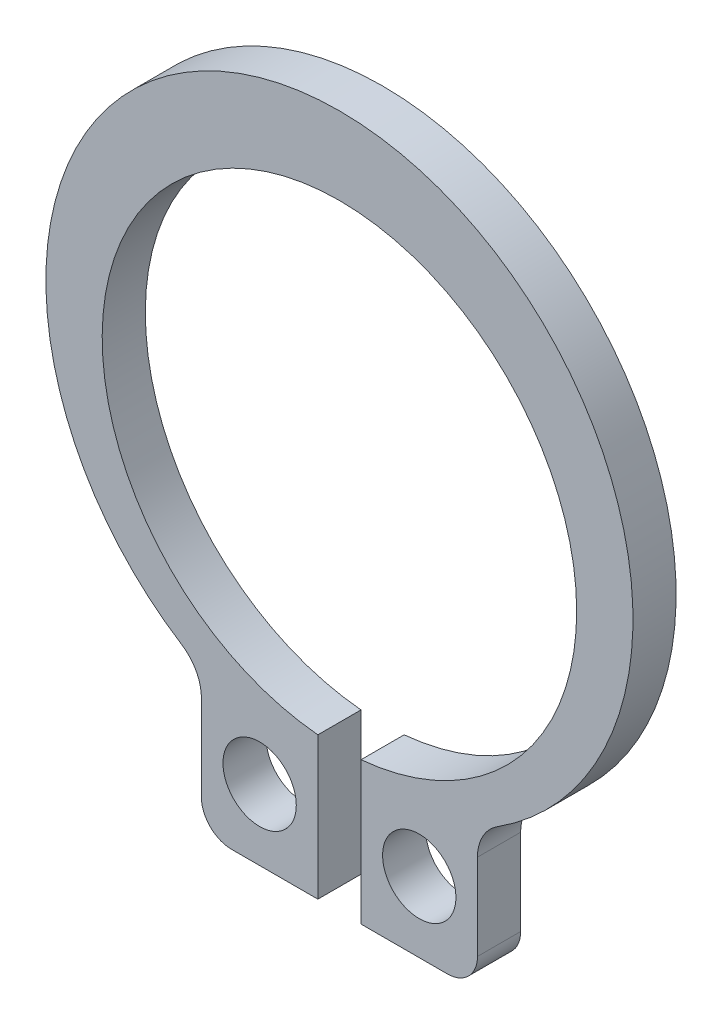
ISO-10303-21;
HEADER;
FILE_DESCRIPTION(('STEP AP214'),'2;1');
FILE_NAME('part.step','',(''),(''),'','','');
FILE_SCHEMA(('AUTOMOTIVE_DESIGN { 1 0 10303 214 1 1 1 1 }'));
ENDSEC;
DATA;
#1=APPLICATION_CONTEXT('core data for automotive mechanical design processes');
#2=APPLICATION_PROTOCOL_DEFINITION('international standard','automotive_design',2000,#1);
#3=PRODUCT_CONTEXT('',#1,'mechanical');
#4=PRODUCT('Part','Part','',(#3));
#5=PRODUCT_RELATED_PRODUCT_CATEGORY('part','',(#4));
#6=PRODUCT_DEFINITION_FORMATION('','',#4);
#7=PRODUCT_DEFINITION_CONTEXT('part definition',#1,'design');
#8=PRODUCT_DEFINITION('design','',#6,#7);
#9=PRODUCT_DEFINITION_SHAPE('','',#8);
#10=(LENGTH_UNIT() NAMED_UNIT(*) SI_UNIT(.MILLI.,.METRE.));
#11=(NAMED_UNIT(*) PLANE_ANGLE_UNIT() SI_UNIT($,.RADIAN.));
#12=(NAMED_UNIT(*) SI_UNIT($,.STERADIAN.) SOLID_ANGLE_UNIT());
#13=UNCERTAINTY_MEASURE_WITH_UNIT(LENGTH_MEASURE(1.E-05),#10,'distance_accuracy_value','');
#14=(GEOMETRIC_REPRESENTATION_CONTEXT(3) GLOBAL_UNCERTAINTY_ASSIGNED_CONTEXT((#13)) GLOBAL_UNIT_ASSIGNED_CONTEXT((#10,
#11,#12)) REPRESENTATION_CONTEXT('',''));
#15=CARTESIAN_POINT('',(0.,0.,0.));
#16=DIRECTION('',(0.,0.,1.));
#17=DIRECTION('',(1.,0.,0.));
#18=AXIS2_PLACEMENT_3D('',#15,#16,#17);
#19=CARTESIAN_POINT('',(0.,0.,1.));
#20=DIRECTION('',(0.,0.,1.));
#21=DIRECTION('',(1.,0.,0.));
#22=AXIS2_PLACEMENT_3D('',#19,#20,#21);
#23=PLANE('',#22);
#24=CARTESIAN_POINT('',(-1.85,-7.14394582484242,1.));
#25=DIRECTION('',(0.,0.,1.));
#26=DIRECTION('',(1.,0.,0.));
#27=AXIS2_PLACEMENT_3D('',#24,#25,#26);
#28=CIRCLE('',#27,0.85);
#29=CARTESIAN_POINT('',(-0.999999999999999,-7.14394582484242,1.));
#30=VERTEX_POINT('',#29);
#31=EDGE_CURVE('E215',#30,#30,#28,.T.);
#32=ORIENTED_EDGE('',*,*,#31,.F.);
#33=EDGE_LOOP('',(#32));
#34=FACE_BOUND('',#33,.T.);
#35=DIRECTION('',(1.,0.,0.));
#36=VECTOR('',#35,1.);
#37=CARTESIAN_POINT('',(0.500000000000001,-8.77722557505166,1.));
#38=LINE('',#37,#36);
#39=CARTESIAN_POINT('',(0.500000000000001,-8.77722557505166,1.));
#40=VERTEX_POINT('',#39);
#41=CARTESIAN_POINT('',(2.5,-8.77722557505166,1.));
#42=VERTEX_POINT('',#41);
#43=EDGE_CURVE('E131',#40,#42,#38,.T.);
#44=ORIENTED_EDGE('',*,*,#43,.T.);
#45=CARTESIAN_POINT('',(2.5,-8.07722557505166,1.));
#46=DIRECTION('',(0.,0.,1.));
#47=DIRECTION('',(1.,0.,0.));
#48=AXIS2_PLACEMENT_3D('',#45,#46,#47);
#49=CIRCLE('',#48,0.7);
#50=CARTESIAN_POINT('',(3.2,-8.07722557505166,1.));
#51=VERTEX_POINT('',#50);
#52=EDGE_CURVE('E181',#42,#51,#49,.T.);
#53=ORIENTED_EDGE('',*,*,#52,.T.);
#54=DIRECTION('',(0.,1.,0.));
#55=VECTOR('',#54,1.);
#56=CARTESIAN_POINT('',(3.2,-8.77722557505166,1.));
#57=LINE('',#56,#55);
#58=CARTESIAN_POINT('',(3.2,-6.0836035752278,1.));
#59=VERTEX_POINT('',#58);
#60=EDGE_CURVE('E235',#51,#59,#57,.T.);
#61=ORIENTED_EDGE('',*,*,#60,.T.);
#62=CARTESIAN_POINT('',(4.2,-6.0836035752278,1.));
#63=DIRECTION('',(0.,0.,1.));
#64=DIRECTION('',(1.,0.,0.));
#65=AXIS2_PLACEMENT_3D('',#62,#63,#64);
#66=CIRCLE('',#65,1.);
#67=CARTESIAN_POINT('',(3.66188340807175,-5.24073316200194,1.));
#68=VERTEX_POINT('',#67);
#69=EDGE_CURVE('E165',#59,#68,#66,.F.);
#70=ORIENTED_EDGE('',*,*,#69,.T.);
#71=CARTESIAN_POINT('',(0.,0.495000000000001,1.));
#72=DIRECTION('',(0.,0.,1.));
#73=DIRECTION('',(1.,0.,0.));
#74=AXIS2_PLACEMENT_3D('',#71,#72,#73);
#75=CIRCLE('',#74,6.805);
#76=CARTESIAN_POINT('',(-3.66188340807175,-5.24073316200195,1.));
#77=VERTEX_POINT('',#76);
#78=EDGE_CURVE('E233',#68,#77,#75,.T.);
#79=ORIENTED_EDGE('',*,*,#78,.T.);
#80=CARTESIAN_POINT('',(-4.2,-6.0836035752278,1.));
#81=DIRECTION('',(0.,0.,1.));
#82=DIRECTION('',(1.,0.,0.));
#83=AXIS2_PLACEMENT_3D('',#80,#81,#82);
#84=CIRCLE('',#83,1.);
#85=CARTESIAN_POINT('',(-3.2,-6.0836035752278,1.));
#86=VERTEX_POINT('',#85);
#87=EDGE_CURVE('E169',#77,#86,#84,.F.);
#88=ORIENTED_EDGE('',*,*,#87,.T.);
#89=DIRECTION('',(0.,-1.,0.));
#90=VECTOR('',#89,1.);
#91=CARTESIAN_POINT('',(-3.2,-8.77722557505166,1.));
#92=LINE('',#91,#90);
#93=CARTESIAN_POINT('',(-3.2,-8.07722557505166,1.));
#94=VERTEX_POINT('',#93);
#95=EDGE_CURVE('E209',#86,#94,#92,.T.);
#96=ORIENTED_EDGE('',*,*,#95,.T.);
#97=CARTESIAN_POINT('',(-2.5,-8.07722557505166,1.));
#98=DIRECTION('',(0.,0.,1.));
#99=DIRECTION('',(1.,0.,0.));
#100=AXIS2_PLACEMENT_3D('',#97,#98,#99);
#101=CIRCLE('',#100,0.7);
#102=CARTESIAN_POINT('',(-2.5,-8.77722557505166,1.));
#103=VERTEX_POINT('',#102);
#104=EDGE_CURVE('E47',#94,#103,#101,.T.);
#105=ORIENTED_EDGE('',*,*,#104,.T.);
#106=DIRECTION('',(1.,0.,0.));
#107=VECTOR('',#106,1.);
#108=CARTESIAN_POINT('',(-0.499999999999999,-8.77722557505166,1.));
#109=LINE('',#108,#107);
#110=CARTESIAN_POINT('',(-0.499999999999999,-8.77722557505166,1.));
#111=VERTEX_POINT('',#110);
#112=EDGE_CURVE('E190',#103,#111,#109,.T.);
#113=ORIENTED_EDGE('',*,*,#112,.T.);
#114=DIRECTION('',(0.,1.,0.));
#115=VECTOR('',#114,1.);
#116=CARTESIAN_POINT('',(-0.499999999999999,-5.47722557505166,1.));
#117=LINE('',#116,#115);
#118=CARTESIAN_POINT('',(-0.499999999999999,-5.47722557505166,1.));
#119=VERTEX_POINT('',#118);
#120=EDGE_CURVE('E137',#111,#119,#117,.T.);
#121=ORIENTED_EDGE('',*,*,#120,.T.);
#122=CARTESIAN_POINT('',(0.,0.,1.));
#123=DIRECTION('',(0.,0.,-1.));
#124=DIRECTION('',(1.,0.,0.));
#125=AXIS2_PLACEMENT_3D('',#122,#123,#124);
#126=CIRCLE('',#125,5.5);
#127=CARTESIAN_POINT('',(0.500000000000001,-5.47722557505166,1.));
#128=VERTEX_POINT('',#127);
#129=EDGE_CURVE('E132',#119,#128,#126,.T.);
#130=ORIENTED_EDGE('',*,*,#129,.T.);
#131=DIRECTION('',(0.,-1.,0.));
#132=VECTOR('',#131,1.);
#133=CARTESIAN_POINT('',(0.500000000000001,-5.47722557505166,1.));
#134=LINE('',#133,#132);
#135=EDGE_CURVE('E121',#128,#40,#134,.T.);
#136=ORIENTED_EDGE('',*,*,#135,.T.);
#137=EDGE_LOOP('',(#44,#53,#61,#70,#79,#88,#96,#105,#113,#121,#130,#136));
#138=FACE_BOUND('',#137,.T.);
#139=CARTESIAN_POINT('',(1.85,-7.14394582484242,1.));
#140=DIRECTION('',(0.,0.,1.));
#141=DIRECTION('',(-1.,0.,0.));
#142=AXIS2_PLACEMENT_3D('',#139,#140,#141);
#143=CIRCLE('',#142,0.85);
#144=CARTESIAN_POINT('',(1.,-7.14394582484242,1.));
#145=VERTEX_POINT('',#144);
#146=EDGE_CURVE('E243',#145,#145,#143,.T.);
#147=ORIENTED_EDGE('',*,*,#146,.F.);
#148=EDGE_LOOP('',(#147));
#149=FACE_BOUND('',#148,.T.);
#150=ADVANCED_FACE('F32',(#34,#138,#149),#23,.T.);
#151=CARTESIAN_POINT('',(0.,0.,0.));
#152=DIRECTION('',(0.,0.,1.));
#153=DIRECTION('',(1.,0.,0.));
#154=AXIS2_PLACEMENT_3D('',#151,#152,#153);
#155=PLANE('',#154);
#156=CARTESIAN_POINT('',(-1.85,-7.14394582484242,0.));
#157=DIRECTION('',(0.,0.,1.));
#158=DIRECTION('',(1.,0.,0.));
#159=AXIS2_PLACEMENT_3D('',#156,#157,#158);
#160=CIRCLE('',#159,0.85);
#161=CARTESIAN_POINT('',(-0.999999999999999,-7.14394582484242,0.));
#162=VERTEX_POINT('',#161);
#163=EDGE_CURVE('E240',#162,#162,#160,.T.);
#164=ORIENTED_EDGE('',*,*,#163,.T.);
#165=EDGE_LOOP('',(#164));
#166=FACE_BOUND('',#165,.T.);
#167=DIRECTION('',(0.,1.,0.));
#168=VECTOR('',#167,1.);
#169=CARTESIAN_POINT('',(3.2,-8.77722557505166,0.));
#170=LINE('',#169,#168);
#171=CARTESIAN_POINT('',(3.2,-8.07722557505166,0.));
#172=VERTEX_POINT('',#171);
#173=CARTESIAN_POINT('',(3.2,-6.0836035752278,0.));
#174=VERTEX_POINT('',#173);
#175=EDGE_CURVE('E220',#172,#174,#170,.T.);
#176=ORIENTED_EDGE('',*,*,#175,.F.);
#177=CARTESIAN_POINT('',(2.5,-8.07722557505166,0.));
#178=DIRECTION('',(0.,0.,1.));
#179=DIRECTION('',(1.,0.,0.));
#180=AXIS2_PLACEMENT_3D('',#177,#178,#179);
#181=CIRCLE('',#180,0.7);
#182=CARTESIAN_POINT('',(2.5,-8.77722557505166,0.));
#183=VERTEX_POINT('',#182);
#184=EDGE_CURVE('E176',#172,#183,#181,.F.);
#185=ORIENTED_EDGE('',*,*,#184,.T.);
#186=DIRECTION('',(1.,0.,0.));
#187=VECTOR('',#186,1.);
#188=CARTESIAN_POINT('',(0.500000000000001,-8.77722557505166,0.));
#189=LINE('',#188,#187);
#190=CARTESIAN_POINT('',(0.500000000000001,-8.77722557505166,0.));
#191=VERTEX_POINT('',#190);
#192=EDGE_CURVE('E217',#191,#183,#189,.T.);
#193=ORIENTED_EDGE('',*,*,#192,.F.);
#194=DIRECTION('',(0.,-1.,0.));
#195=VECTOR('',#194,1.);
#196=CARTESIAN_POINT('',(0.500000000000001,-5.47722557505166,0.));
#197=LINE('',#196,#195);
#198=CARTESIAN_POINT('',(0.500000000000001,-5.47722557505166,0.));
#199=VERTEX_POINT('',#198);
#200=EDGE_CURVE('E214',#199,#191,#197,.T.);
#201=ORIENTED_EDGE('',*,*,#200,.F.);
#202=CARTESIAN_POINT('',(0.,0.,0.));
#203=DIRECTION('',(0.,0.,-1.));
#204=DIRECTION('',(1.,0.,0.));
#205=AXIS2_PLACEMENT_3D('',#202,#203,#204);
#206=CIRCLE('',#205,5.5);
#207=CARTESIAN_POINT('',(-0.499999999999999,-5.47722557505166,0.));
#208=VERTEX_POINT('',#207);
#209=EDGE_CURVE('E145',#208,#199,#206,.T.);
#210=ORIENTED_EDGE('',*,*,#209,.F.);
#211=DIRECTION('',(0.,1.,0.));
#212=VECTOR('',#211,1.);
#213=CARTESIAN_POINT('',(-0.499999999999999,-5.47722557505166,0.));
#214=LINE('',#213,#212);
#215=CARTESIAN_POINT('',(-0.499999999999999,-8.77722557505166,0.));
#216=VERTEX_POINT('',#215);
#217=EDGE_CURVE('E141',#216,#208,#214,.T.);
#218=ORIENTED_EDGE('',*,*,#217,.F.);
#219=DIRECTION('',(1.,0.,0.));
#220=VECTOR('',#219,1.);
#221=CARTESIAN_POINT('',(-0.499999999999999,-8.77722557505166,0.));
#222=LINE('',#221,#220);
#223=CARTESIAN_POINT('',(-2.5,-8.77722557505166,0.));
#224=VERTEX_POINT('',#223);
#225=EDGE_CURVE('E188',#224,#216,#222,.T.);
#226=ORIENTED_EDGE('',*,*,#225,.F.);
#227=CARTESIAN_POINT('',(-2.5,-8.07722557505166,0.));
#228=DIRECTION('',(0.,0.,1.));
#229=DIRECTION('',(1.,0.,0.));
#230=AXIS2_PLACEMENT_3D('',#227,#228,#229);
#231=CIRCLE('',#230,0.7);
#232=CARTESIAN_POINT('',(-3.2,-8.07722557505166,0.));
#233=VERTEX_POINT('',#232);
#234=EDGE_CURVE('E174',#224,#233,#231,.F.);
#235=ORIENTED_EDGE('',*,*,#234,.T.);
#236=DIRECTION('',(0.,-1.,0.));
#237=VECTOR('',#236,1.);
#238=CARTESIAN_POINT('',(-3.2,-8.77722557505166,0.));
#239=LINE('',#238,#237);
#240=CARTESIAN_POINT('',(-3.2,-6.0836035752278,0.));
#241=VERTEX_POINT('',#240);
#242=EDGE_CURVE('E198',#241,#233,#239,.T.);
#243=ORIENTED_EDGE('',*,*,#242,.F.);
#244=CARTESIAN_POINT('',(-4.2,-6.0836035752278,0.));
#245=DIRECTION('',(0.,0.,1.));
#246=DIRECTION('',(1.,0.,0.));
#247=AXIS2_PLACEMENT_3D('',#244,#245,#246);
#248=CIRCLE('',#247,1.);
#249=CARTESIAN_POINT('',(-3.66188340807175,-5.24073316200195,0.));
#250=VERTEX_POINT('',#249);
#251=EDGE_CURVE('E167',#241,#250,#248,.T.);
#252=ORIENTED_EDGE('',*,*,#251,.T.);
#253=CARTESIAN_POINT('',(0.,0.495000000000001,0.));
#254=DIRECTION('',(0.,0.,1.));
#255=DIRECTION('',(1.,0.,0.));
#256=AXIS2_PLACEMENT_3D('',#253,#254,#255);
#257=CIRCLE('',#256,6.805);
#258=CARTESIAN_POINT('',(3.66188340807175,-5.24073316200194,0.));
#259=VERTEX_POINT('',#258);
#260=EDGE_CURVE('E201',#259,#250,#257,.T.);
#261=ORIENTED_EDGE('',*,*,#260,.F.);
#262=CARTESIAN_POINT('',(4.2,-6.0836035752278,0.));
#263=DIRECTION('',(0.,0.,1.));
#264=DIRECTION('',(1.,0.,0.));
#265=AXIS2_PLACEMENT_3D('',#262,#263,#264);
#266=CIRCLE('',#265,1.);
#267=EDGE_CURVE('E162',#259,#174,#266,.T.);
#268=ORIENTED_EDGE('',*,*,#267,.T.);
#269=EDGE_LOOP('',(#176,#185,#193,#201,#210,#218,#226,#235,#243,#252,#261,#268));
#270=FACE_BOUND('',#269,.T.);
#271=CARTESIAN_POINT('',(1.85,-7.14394582484242,0.));
#272=DIRECTION('',(0.,0.,1.));
#273=DIRECTION('',(-1.,0.,0.));
#274=AXIS2_PLACEMENT_3D('',#271,#272,#273);
#275=CIRCLE('',#274,0.85);
#276=CARTESIAN_POINT('',(1.,-7.14394582484242,0.));
#277=VERTEX_POINT('',#276);
#278=EDGE_CURVE('E246',#277,#277,#275,.T.);
#279=ORIENTED_EDGE('',*,*,#278,.T.);
#280=EDGE_LOOP('',(#279));
#281=FACE_BOUND('',#280,.T.);
#282=ADVANCED_FACE('F195',(#166,#270,#281),#155,.F.);
#283=CARTESIAN_POINT('',(0.,0.,1.));
#284=DIRECTION('',(0.,0.,-1.));
#285=DIRECTION('',(-1.,0.,0.));
#286=AXIS2_PLACEMENT_3D('',#283,#284,#285);
#287=CYLINDRICAL_SURFACE('',#286,5.5);
#288=ORIENTED_EDGE('',*,*,#209,.T.);
#289=DIRECTION('',(0.,0.,-1.));
#290=VECTOR('',#289,1.);
#291=CARTESIAN_POINT('',(0.500000000000001,-5.47722557505166,1.));
#292=LINE('',#291,#290);
#293=EDGE_CURVE('E125',#128,#199,#292,.T.);
#294=ORIENTED_EDGE('',*,*,#293,.F.);
#295=ORIENTED_EDGE('',*,*,#129,.F.);
#296=DIRECTION('',(0.,0.,-1.));
#297=VECTOR('',#296,1.);
#298=CARTESIAN_POINT('',(-0.499999999999999,-5.47722557505166,1.));
#299=LINE('',#298,#297);
#300=EDGE_CURVE('E205',#119,#208,#299,.T.);
#301=ORIENTED_EDGE('',*,*,#300,.T.);
#302=EDGE_LOOP('',(#288,#294,#295,#301));
#303=FACE_BOUND('',#302,.T.);
#304=ADVANCED_FACE('F143',(#303),#287,.F.);
#305=CARTESIAN_POINT('',(0.500000000000001,-5.47722557505166,1.));
#306=DIRECTION('',(1.,0.,0.));
#307=DIRECTION('',(0.,1.,0.));
#308=AXIS2_PLACEMENT_3D('',#305,#306,#307);
#309=PLANE('',#308);
#310=ORIENTED_EDGE('',*,*,#200,.T.);
#311=DIRECTION('',(0.,0.,-1.));
#312=VECTOR('',#311,1.);
#313=CARTESIAN_POINT('',(0.500000000000001,-8.77722557505166,1.));
#314=LINE('',#313,#312);
#315=EDGE_CURVE('E128',#40,#191,#314,.T.);
#316=ORIENTED_EDGE('',*,*,#315,.F.);
#317=ORIENTED_EDGE('',*,*,#135,.F.);
#318=ORIENTED_EDGE('',*,*,#293,.T.);
#319=EDGE_LOOP('',(#310,#316,#317,#318));
#320=FACE_BOUND('',#319,.T.);
#321=ADVANCED_FACE('F123',(#320),#309,.F.);
#322=CARTESIAN_POINT('',(0.500000000000001,-8.77722557505166,1.));
#323=DIRECTION('',(0.,1.,0.));
#324=DIRECTION('',(0.,0.,1.));
#325=AXIS2_PLACEMENT_3D('',#322,#323,#324);
#326=PLANE('',#325);
#327=ORIENTED_EDGE('',*,*,#192,.T.);
#328=DIRECTION('',(0.,0.,-1.));
#329=VECTOR('',#328,1.);
#330=CARTESIAN_POINT('',(2.5,-8.77722557505166,1.));
#331=LINE('',#330,#329);
#332=EDGE_CURVE('E178',#183,#42,#331,.F.);
#333=ORIENTED_EDGE('',*,*,#332,.T.);
#334=ORIENTED_EDGE('',*,*,#43,.F.);
#335=ORIENTED_EDGE('',*,*,#315,.T.);
#336=EDGE_LOOP('',(#327,#333,#334,#335));
#337=FACE_BOUND('',#336,.T.);
#338=ADVANCED_FACE('F278',(#337),#326,.F.);
#339=CARTESIAN_POINT('',(3.2,-8.77722557505166,1.));
#340=DIRECTION('',(-1.,0.,0.));
#341=DIRECTION('',(0.,0.,1.));
#342=AXIS2_PLACEMENT_3D('',#339,#340,#341);
#343=PLANE('',#342);
#344=ORIENTED_EDGE('',*,*,#60,.F.);
#345=DIRECTION('',(0.,0.,-1.));
#346=VECTOR('',#345,1.);
#347=CARTESIAN_POINT('',(3.2,-8.07722557505166,1.));
#348=LINE('',#347,#346);
#349=EDGE_CURVE('E171',#51,#172,#348,.T.);
#350=ORIENTED_EDGE('',*,*,#349,.T.);
#351=ORIENTED_EDGE('',*,*,#175,.T.);
#352=DIRECTION('',(0.,0.,1.));
#353=VECTOR('',#352,1.);
#354=CARTESIAN_POINT('',(3.2,-6.0836035752278,1.));
#355=LINE('',#354,#353);
#356=EDGE_CURVE('E156',#174,#59,#355,.T.);
#357=ORIENTED_EDGE('',*,*,#356,.T.);
#358=EDGE_LOOP('',(#344,#350,#351,#357));
#359=FACE_BOUND('',#358,.T.);
#360=ADVANCED_FACE('F275',(#359),#343,.F.);
#361=CARTESIAN_POINT('',(0.,0.495000000000001,1.));
#362=DIRECTION('',(0.,0.,-1.));
#363=DIRECTION('',(-1.,0.,0.));
#364=AXIS2_PLACEMENT_3D('',#361,#362,#363);
#365=CYLINDRICAL_SURFACE('',#364,6.805);
#366=ORIENTED_EDGE('',*,*,#78,.F.);
#367=DIRECTION('',(0.,0.,-1.));
#368=VECTOR('',#367,1.);
#369=CARTESIAN_POINT('',(3.66188340807175,-5.24073316200195,1.));
#370=LINE('',#369,#368);
#371=EDGE_CURVE('E148',#68,#259,#370,.T.);
#372=ORIENTED_EDGE('',*,*,#371,.T.);
#373=ORIENTED_EDGE('',*,*,#260,.T.);
#374=DIRECTION('',(0.,0.,-1.));
#375=VECTOR('',#374,1.);
#376=CARTESIAN_POINT('',(-3.66188340807175,-5.24073316200195,1.));
#377=LINE('',#376,#375);
#378=EDGE_CURVE('E146',#250,#77,#377,.F.);
#379=ORIENTED_EDGE('',*,*,#378,.T.);
#380=EDGE_LOOP('',(#366,#372,#373,#379));
#381=FACE_BOUND('',#380,.T.);
#382=ADVANCED_FACE('F226',(#381),#365,.T.);
#383=CARTESIAN_POINT('',(-3.2,-8.77722557505166,1.));
#384=DIRECTION('',(1.,0.,0.));
#385=DIRECTION('',(0.,1.,0.));
#386=AXIS2_PLACEMENT_3D('',#383,#384,#385);
#387=PLANE('',#386);
#388=ORIENTED_EDGE('',*,*,#242,.T.);
#389=DIRECTION('',(0.,0.,-1.));
#390=VECTOR('',#389,1.);
#391=CARTESIAN_POINT('',(-3.2,-8.07722557505166,1.));
#392=LINE('',#391,#390);
#393=EDGE_CURVE('E11',#233,#94,#392,.F.);
#394=ORIENTED_EDGE('',*,*,#393,.T.);
#395=ORIENTED_EDGE('',*,*,#95,.F.);
#396=DIRECTION('',(0.,0.,1.));
#397=VECTOR('',#396,1.);
#398=CARTESIAN_POINT('',(-3.2,-6.0836035752278,0.));
#399=LINE('',#398,#397);
#400=EDGE_CURVE('E159',#86,#241,#399,.F.);
#401=ORIENTED_EDGE('',*,*,#400,.T.);
#402=EDGE_LOOP('',(#388,#394,#395,#401));
#403=FACE_BOUND('',#402,.T.);
#404=ADVANCED_FACE('F234',(#403),#387,.F.);
#405=CARTESIAN_POINT('',(-0.499999999999999,-8.77722557505166,1.));
#406=DIRECTION('',(0.,1.,0.));
#407=DIRECTION('',(0.,0.,1.));
#408=AXIS2_PLACEMENT_3D('',#405,#406,#407);
#409=PLANE('',#408);
#410=ORIENTED_EDGE('',*,*,#112,.F.);
#411=DIRECTION('',(0.,0.,-1.));
#412=VECTOR('',#411,1.);
#413=CARTESIAN_POINT('',(-2.5,-8.77722557505166,1.));
#414=LINE('',#413,#412);
#415=EDGE_CURVE('E40',#103,#224,#414,.T.);
#416=ORIENTED_EDGE('',*,*,#415,.T.);
#417=ORIENTED_EDGE('',*,*,#225,.T.);
#418=DIRECTION('',(0.,0.,-1.));
#419=VECTOR('',#418,1.);
#420=CARTESIAN_POINT('',(-0.499999999999999,-8.77722557505166,1.));
#421=LINE('',#420,#419);
#422=EDGE_CURVE('E150',#111,#216,#421,.T.);
#423=ORIENTED_EDGE('',*,*,#422,.F.);
#424=EDGE_LOOP('',(#410,#416,#417,#423));
#425=FACE_BOUND('',#424,.T.);
#426=ADVANCED_FACE('F186',(#425),#409,.F.);
#427=CARTESIAN_POINT('',(-0.499999999999999,-5.47722557505166,1.));
#428=DIRECTION('',(-1.,0.,0.));
#429=DIRECTION('',(0.,-1.,0.));
#430=AXIS2_PLACEMENT_3D('',#427,#428,#429);
#431=PLANE('',#430);
#432=ORIENTED_EDGE('',*,*,#217,.T.);
#433=ORIENTED_EDGE('',*,*,#300,.F.);
#434=ORIENTED_EDGE('',*,*,#120,.F.);
#435=ORIENTED_EDGE('',*,*,#422,.T.);
#436=EDGE_LOOP('',(#432,#433,#434,#435));
#437=FACE_BOUND('',#436,.T.);
#438=ADVANCED_FACE('F207',(#437),#431,.F.);
#439=CARTESIAN_POINT('',(-1.85,-7.14394582484242,1.));
#440=DIRECTION('',(0.,0.,-1.));
#441=DIRECTION('',(-1.,0.,0.));
#442=AXIS2_PLACEMENT_3D('',#439,#440,#441);
#443=CYLINDRICAL_SURFACE('',#442,0.85);
#444=ORIENTED_EDGE('',*,*,#31,.T.);
#445=EDGE_LOOP('',(#444));
#446=FACE_BOUND('',#445,.T.);
#447=ORIENTED_EDGE('',*,*,#163,.F.);
#448=EDGE_LOOP('',(#447));
#449=FACE_BOUND('',#448,.T.);
#450=ADVANCED_FACE('F264',(#446,#449),#443,.F.);
#451=CARTESIAN_POINT('',(1.85,-7.14394582484242,1.));
#452=DIRECTION('',(0.,0.,-1.));
#453=DIRECTION('',(-1.,0.,0.));
#454=AXIS2_PLACEMENT_3D('',#451,#452,#453);
#455=CYLINDRICAL_SURFACE('',#454,0.85);
#456=ORIENTED_EDGE('',*,*,#146,.T.);
#457=EDGE_LOOP('',(#456));
#458=FACE_BOUND('',#457,.T.);
#459=ORIENTED_EDGE('',*,*,#278,.F.);
#460=EDGE_LOOP('',(#459));
#461=FACE_BOUND('',#460,.T.);
#462=ADVANCED_FACE('F252',(#458,#461),#455,.F.);
#463=CARTESIAN_POINT('',(4.2,-6.0836035752278,1.));
#464=DIRECTION('',(0.,0.,-1.));
#465=DIRECTION('',(-1.,0.,0.));
#466=AXIS2_PLACEMENT_3D('',#463,#464,#465);
#467=CYLINDRICAL_SURFACE('',#466,1.);
#468=ORIENTED_EDGE('',*,*,#69,.F.);
#469=ORIENTED_EDGE('',*,*,#356,.F.);
#470=ORIENTED_EDGE('',*,*,#267,.F.);
#471=ORIENTED_EDGE('',*,*,#371,.F.);
#472=EDGE_LOOP('',(#468,#469,#470,#471));
#473=FACE_BOUND('',#472,.T.);
#474=ADVANCED_FACE('F287',(#473),#467,.F.);
#475=CARTESIAN_POINT('',(-4.2,-6.0836035752278,1.));
#476=DIRECTION('',(0.,0.,-1.));
#477=DIRECTION('',(-1.,0.,0.));
#478=AXIS2_PLACEMENT_3D('',#475,#476,#477);
#479=CYLINDRICAL_SURFACE('',#478,1.);
#480=ORIENTED_EDGE('',*,*,#87,.F.);
#481=ORIENTED_EDGE('',*,*,#378,.F.);
#482=ORIENTED_EDGE('',*,*,#251,.F.);
#483=ORIENTED_EDGE('',*,*,#400,.F.);
#484=EDGE_LOOP('',(#480,#481,#482,#483));
#485=FACE_BOUND('',#484,.T.);
#486=ADVANCED_FACE('F231',(#485),#479,.F.);
#487=CARTESIAN_POINT('',(2.5,-8.07722557505166,1.));
#488=DIRECTION('',(0.,0.,-1.));
#489=DIRECTION('',(-1.,0.,0.));
#490=AXIS2_PLACEMENT_3D('',#487,#488,#489);
#491=CYLINDRICAL_SURFACE('',#490,0.7);
#492=ORIENTED_EDGE('',*,*,#52,.F.);
#493=ORIENTED_EDGE('',*,*,#332,.F.);
#494=ORIENTED_EDGE('',*,*,#184,.F.);
#495=ORIENTED_EDGE('',*,*,#349,.F.);
#496=EDGE_LOOP('',(#492,#493,#494,#495));
#497=FACE_BOUND('',#496,.T.);
#498=ADVANCED_FACE('F292',(#497),#491,.T.);
#499=CARTESIAN_POINT('',(-2.5,-8.07722557505166,1.));
#500=DIRECTION('',(0.,0.,-1.));
#501=DIRECTION('',(-1.,0.,0.));
#502=AXIS2_PLACEMENT_3D('',#499,#500,#501);
#503=CYLINDRICAL_SURFACE('',#502,0.7);
#504=ORIENTED_EDGE('',*,*,#104,.F.);
#505=ORIENTED_EDGE('',*,*,#393,.F.);
#506=ORIENTED_EDGE('',*,*,#234,.F.);
#507=ORIENTED_EDGE('',*,*,#415,.F.);
#508=EDGE_LOOP('',(#504,#505,#506,#507));
#509=FACE_BOUND('',#508,.T.);
#510=ADVANCED_FACE('F34',(#509),#503,.T.);
#511=CLOSED_SHELL('',(#150,#282,#304,#321,#338,#360,#382,#404,#426,#438,#450,#462,#474,#486,
#498,#510));
#512=MANIFOLD_SOLID_BREP('B2',#511);
#513=ADVANCED_BREP_SHAPE_REPRESENTATION('',(#18,#512),#14);
#514=SHAPE_DEFINITION_REPRESENTATION(#9,#513);
ENDSEC;
END-ISO-10303-21;
